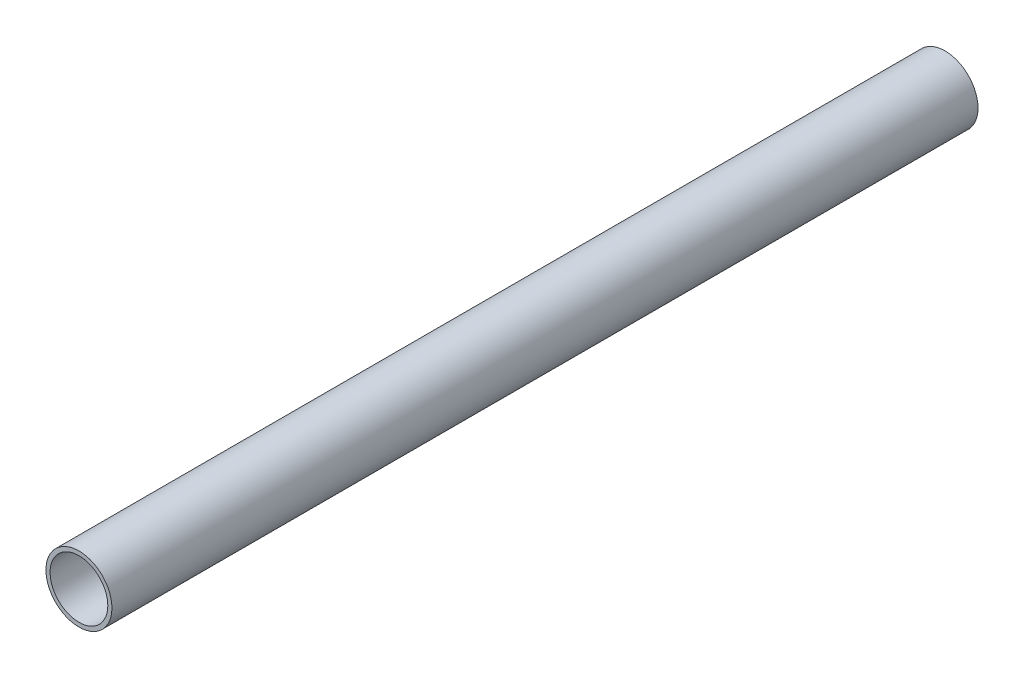
ISO-10303-21;
HEADER;
FILE_DESCRIPTION(('STEP AP214'),'2;1');
FILE_NAME('part.step','',(''),(''),'','','');
FILE_SCHEMA(('AUTOMOTIVE_DESIGN { 1 0 10303 214 1 1 1 1 }'));
ENDSEC;
DATA;
#1=APPLICATION_CONTEXT('core data for automotive mechanical design processes');
#2=APPLICATION_PROTOCOL_DEFINITION('international standard','automotive_design',2000,#1);
#3=PRODUCT_CONTEXT('',#1,'mechanical');
#4=PRODUCT('Part','Part','',(#3));
#5=PRODUCT_RELATED_PRODUCT_CATEGORY('part','',(#4));
#6=PRODUCT_DEFINITION_FORMATION('','',#4);
#7=PRODUCT_DEFINITION_CONTEXT('part definition',#1,'design');
#8=PRODUCT_DEFINITION('design','',#6,#7);
#9=PRODUCT_DEFINITION_SHAPE('','',#8);
#10=(LENGTH_UNIT() NAMED_UNIT(*) SI_UNIT(.MILLI.,.METRE.));
#11=(NAMED_UNIT(*) PLANE_ANGLE_UNIT() SI_UNIT($,.RADIAN.));
#12=(NAMED_UNIT(*) SI_UNIT($,.STERADIAN.) SOLID_ANGLE_UNIT());
#13=UNCERTAINTY_MEASURE_WITH_UNIT(LENGTH_MEASURE(1.E-05),#10,'distance_accuracy_value','');
#14=(GEOMETRIC_REPRESENTATION_CONTEXT(3) GLOBAL_UNCERTAINTY_ASSIGNED_CONTEXT((#13)) GLOBAL_UNIT_ASSIGNED_CONTEXT((#10,
#11,#12)) REPRESENTATION_CONTEXT('',''));
#15=CARTESIAN_POINT('',(0.,0.,0.));
#16=DIRECTION('',(0.,0.,1.));
#17=DIRECTION('',(1.,0.,0.));
#18=AXIS2_PLACEMENT_3D('',#15,#16,#17);
#19=CARTESIAN_POINT('',(0.,0.,105.));
#20=DIRECTION('',(0.,0.,1.));
#21=DIRECTION('',(1.,0.,0.));
#22=AXIS2_PLACEMENT_3D('',#19,#20,#21);
#23=PLANE('',#22);
#24=CARTESIAN_POINT('',(0.,0.,105.));
#25=DIRECTION('',(0.,0.,1.));
#26=DIRECTION('',(1.,0.,0.));
#27=AXIS2_PLACEMENT_3D('',#24,#25,#26);
#28=CIRCLE('',#27,4.);
#29=CARTESIAN_POINT('',(4.,0.,105.));
#30=VERTEX_POINT('',#29);
#31=EDGE_CURVE('E10',#30,#30,#28,.T.);
#32=ORIENTED_EDGE('',*,*,#31,.T.);
#33=EDGE_LOOP('',(#32));
#34=FACE_BOUND('',#33,.T.);
#35=CARTESIAN_POINT('',(0.,0.,105.));
#36=DIRECTION('',(0.,0.,1.));
#37=DIRECTION('',(1.,0.,0.));
#38=AXIS2_PLACEMENT_3D('',#35,#36,#37);
#39=CIRCLE('',#38,3.5);
#40=CARTESIAN_POINT('',(3.5,0.,105.));
#41=VERTEX_POINT('',#40);
#42=EDGE_CURVE('E44',#41,#41,#39,.T.);
#43=ORIENTED_EDGE('',*,*,#42,.F.);
#44=EDGE_LOOP('',(#43));
#45=FACE_BOUND('',#44,.T.);
#46=ADVANCED_FACE('F33',(#34,#45),#23,.T.);
#47=CARTESIAN_POINT('',(0.,0.,0.));
#48=DIRECTION('',(0.,0.,1.));
#49=DIRECTION('',(1.,0.,0.));
#50=AXIS2_PLACEMENT_3D('',#47,#48,#49);
#51=PLANE('',#50);
#52=CARTESIAN_POINT('',(0.,0.,0.));
#53=DIRECTION('',(0.,0.,1.));
#54=DIRECTION('',(1.,0.,0.));
#55=AXIS2_PLACEMENT_3D('',#52,#53,#54);
#56=CIRCLE('',#55,4.);
#57=CARTESIAN_POINT('',(4.,0.,0.));
#58=VERTEX_POINT('',#57);
#59=EDGE_CURVE('E37',#58,#58,#56,.T.);
#60=ORIENTED_EDGE('',*,*,#59,.F.);
#61=EDGE_LOOP('',(#60));
#62=FACE_BOUND('',#61,.T.);
#63=CARTESIAN_POINT('',(0.,0.,0.));
#64=DIRECTION('',(0.,0.,1.));
#65=DIRECTION('',(1.,0.,0.));
#66=AXIS2_PLACEMENT_3D('',#63,#64,#65);
#67=CIRCLE('',#66,3.5);
#68=CARTESIAN_POINT('',(3.5,0.,0.));
#69=VERTEX_POINT('',#68);
#70=EDGE_CURVE('E46',#69,#69,#67,.T.);
#71=ORIENTED_EDGE('',*,*,#70,.T.);
#72=EDGE_LOOP('',(#71));
#73=FACE_BOUND('',#72,.T.);
#74=ADVANCED_FACE('F56',(#62,#73),#51,.F.);
#75=CARTESIAN_POINT('',(0.,0.,105.));
#76=DIRECTION('',(0.,0.,-1.));
#77=DIRECTION('',(-1.,0.,0.));
#78=AXIS2_PLACEMENT_3D('',#75,#76,#77);
#79=CYLINDRICAL_SURFACE('',#78,4.);
#80=ORIENTED_EDGE('',*,*,#31,.F.);
#81=EDGE_LOOP('',(#80));
#82=FACE_BOUND('',#81,.T.);
#83=ORIENTED_EDGE('',*,*,#59,.T.);
#84=EDGE_LOOP('',(#83));
#85=FACE_BOUND('',#84,.T.);
#86=ADVANCED_FACE('F35',(#82,#85),#79,.T.);
#87=CARTESIAN_POINT('',(0.,0.,105.));
#88=DIRECTION('',(0.,0.,-1.));
#89=DIRECTION('',(-1.,0.,0.));
#90=AXIS2_PLACEMENT_3D('',#87,#88,#89);
#91=CYLINDRICAL_SURFACE('',#90,3.5);
#92=ORIENTED_EDGE('',*,*,#42,.T.);
#93=EDGE_LOOP('',(#92));
#94=FACE_BOUND('',#93,.T.);
#95=ORIENTED_EDGE('',*,*,#70,.F.);
#96=EDGE_LOOP('',(#95));
#97=FACE_BOUND('',#96,.T.);
#98=ADVANCED_FACE('F52',(#94,#97),#91,.F.);
#99=CLOSED_SHELL('',(#46,#74,#86,#98));
#100=MANIFOLD_SOLID_BREP('B2',#99);
#101=ADVANCED_BREP_SHAPE_REPRESENTATION('',(#18,#100),#14);
#102=SHAPE_DEFINITION_REPRESENTATION(#9,#101);
ENDSEC;
END-ISO-10303-21;
